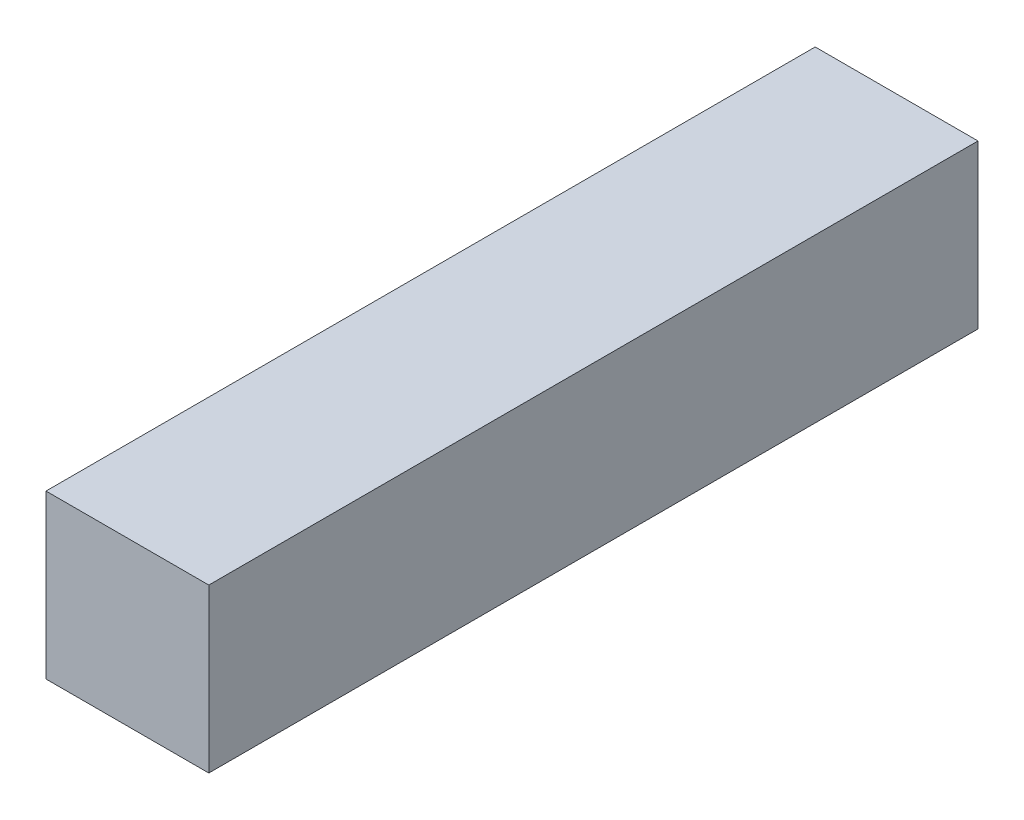
ISO-10303-21;
HEADER;
FILE_DESCRIPTION(('STEP AP214'),'2;1');
FILE_NAME('part.step','',(''),(''),'','','');
FILE_SCHEMA(('AUTOMOTIVE_DESIGN { 1 0 10303 214 1 1 1 1 }'));
ENDSEC;
DATA;
#1=APPLICATION_CONTEXT('core data for automotive mechanical design processes');
#2=APPLICATION_PROTOCOL_DEFINITION('international standard','automotive_design',2000,#1);
#3=PRODUCT_CONTEXT('',#1,'mechanical');
#4=PRODUCT('Part','Part','',(#3));
#5=PRODUCT_RELATED_PRODUCT_CATEGORY('part','',(#4));
#6=PRODUCT_DEFINITION_FORMATION('','',#4);
#7=PRODUCT_DEFINITION_CONTEXT('part definition',#1,'design');
#8=PRODUCT_DEFINITION('design','',#6,#7);
#9=PRODUCT_DEFINITION_SHAPE('','',#8);
#10=(LENGTH_UNIT() NAMED_UNIT(*) SI_UNIT(.MILLI.,.METRE.));
#11=(NAMED_UNIT(*) PLANE_ANGLE_UNIT() SI_UNIT($,.RADIAN.));
#12=(NAMED_UNIT(*) SI_UNIT($,.STERADIAN.) SOLID_ANGLE_UNIT());
#13=UNCERTAINTY_MEASURE_WITH_UNIT(LENGTH_MEASURE(1.E-05),#10,'distance_accuracy_value','');
#14=(GEOMETRIC_REPRESENTATION_CONTEXT(3) GLOBAL_UNCERTAINTY_ASSIGNED_CONTEXT((#13)) GLOBAL_UNIT_ASSIGNED_CONTEXT((#10,
#11,#12)) REPRESENTATION_CONTEXT('',''));
#15=CARTESIAN_POINT('',(0.,0.,0.));
#16=DIRECTION('',(0.,0.,1.));
#17=DIRECTION('',(1.,0.,0.));
#18=AXIS2_PLACEMENT_3D('',#15,#16,#17);
#19=CARTESIAN_POINT('',(3.175,-3.175,30.));
#20=DIRECTION('',(-1.,0.,0.));
#21=DIRECTION('',(0.,0.,1.));
#22=AXIS2_PLACEMENT_3D('',#19,#20,#21);
#23=PLANE('',#22);
#24=DIRECTION('',(0.,0.,1.));
#25=VECTOR('',#24,1.);
#26=CARTESIAN_POINT('',(3.175,3.175,30.));
#27=LINE('',#26,#25);
#28=CARTESIAN_POINT('',(3.175,3.175,0.));
#29=VERTEX_POINT('',#28);
#30=CARTESIAN_POINT('',(3.175,3.175,30.));
#31=VERTEX_POINT('',#30);
#32=EDGE_CURVE('E20',#29,#31,#27,.T.);
#33=ORIENTED_EDGE('',*,*,#32,.T.);
#34=DIRECTION('',(0.,1.,0.));
#35=VECTOR('',#34,1.);
#36=CARTESIAN_POINT('',(3.175,0.,30.));
#37=LINE('',#36,#35);
#38=CARTESIAN_POINT('',(3.175,-3.175,30.));
#39=VERTEX_POINT('',#38);
#40=EDGE_CURVE('E55',#39,#31,#37,.T.);
#41=ORIENTED_EDGE('',*,*,#40,.F.);
#42=DIRECTION('',(0.,0.,1.));
#43=VECTOR('',#42,1.);
#44=CARTESIAN_POINT('',(3.175,-3.175,30.));
#45=LINE('',#44,#43);
#46=CARTESIAN_POINT('',(3.175,-3.175,0.));
#47=VERTEX_POINT('',#46);
#48=EDGE_CURVE('E74',#39,#47,#45,.F.);
#49=ORIENTED_EDGE('',*,*,#48,.T.);
#50=DIRECTION('',(0.,1.,0.));
#51=VECTOR('',#50,1.);
#52=CARTESIAN_POINT('',(3.175,0.,0.));
#53=LINE('',#52,#51);
#54=EDGE_CURVE('E66',#47,#29,#53,.T.);
#55=ORIENTED_EDGE('',*,*,#54,.T.);
#56=EDGE_LOOP('',(#33,#41,#49,#55));
#57=FACE_BOUND('',#56,.T.);
#58=ADVANCED_FACE('F17',(#57),#23,.F.);
#59=CARTESIAN_POINT('',(3.175,3.175,30.));
#60=DIRECTION('',(0.,-1.,0.));
#61=DIRECTION('',(1.,0.,0.));
#62=AXIS2_PLACEMENT_3D('',#59,#60,#61);
#63=PLANE('',#62);
#64=DIRECTION('',(0.,0.,-1.));
#65=VECTOR('',#64,1.);
#66=CARTESIAN_POINT('',(-3.175,3.175,30.));
#67=LINE('',#66,#65);
#68=CARTESIAN_POINT('',(-3.175,3.175,0.));
#69=VERTEX_POINT('',#68);
#70=CARTESIAN_POINT('',(-3.175,3.175,30.));
#71=VERTEX_POINT('',#70);
#72=EDGE_CURVE('E72',#69,#71,#67,.F.);
#73=ORIENTED_EDGE('',*,*,#72,.T.);
#74=DIRECTION('',(1.,0.,0.));
#75=VECTOR('',#74,1.);
#76=CARTESIAN_POINT('',(0.,3.175,30.));
#77=LINE('',#76,#75);
#78=EDGE_CURVE('E62',#31,#71,#77,.F.);
#79=ORIENTED_EDGE('',*,*,#78,.F.);
#80=ORIENTED_EDGE('',*,*,#32,.F.);
#81=DIRECTION('',(1.,0.,0.));
#82=VECTOR('',#81,1.);
#83=CARTESIAN_POINT('',(0.,3.175,0.));
#84=LINE('',#83,#82);
#85=EDGE_CURVE('E80',#29,#69,#84,.F.);
#86=ORIENTED_EDGE('',*,*,#85,.T.);
#87=EDGE_LOOP('',(#73,#79,#80,#86));
#88=FACE_BOUND('',#87,.T.);
#89=ADVANCED_FACE('F71',(#88),#63,.F.);
#90=CARTESIAN_POINT('',(0.,0.,30.));
#91=DIRECTION('',(0.,0.,1.));
#92=DIRECTION('',(1.,0.,0.));
#93=AXIS2_PLACEMENT_3D('',#90,#91,#92);
#94=PLANE('',#93);
#95=ORIENTED_EDGE('',*,*,#40,.T.);
#96=ORIENTED_EDGE('',*,*,#78,.T.);
#97=DIRECTION('',(0.,1.,0.));
#98=VECTOR('',#97,1.);
#99=CARTESIAN_POINT('',(-3.175,-3.175,30.));
#100=LINE('',#99,#98);
#101=CARTESIAN_POINT('',(-3.175,-3.175,30.));
#102=VERTEX_POINT('',#101);
#103=EDGE_CURVE('E83',#71,#102,#100,.F.);
#104=ORIENTED_EDGE('',*,*,#103,.T.);
#105=DIRECTION('',(-1.,0.,0.));
#106=VECTOR('',#105,1.);
#107=CARTESIAN_POINT('',(3.175,-3.175,30.));
#108=LINE('',#107,#106);
#109=EDGE_CURVE('E64',#102,#39,#108,.F.);
#110=ORIENTED_EDGE('',*,*,#109,.T.);
#111=EDGE_LOOP('',(#95,#96,#104,#110));
#112=FACE_BOUND('',#111,.T.);
#113=ADVANCED_FACE('F59',(#112),#94,.T.);
#114=CARTESIAN_POINT('',(3.175,-3.175,30.));
#115=DIRECTION('',(0.,1.,0.));
#116=DIRECTION('',(-1.,0.,0.));
#117=AXIS2_PLACEMENT_3D('',#114,#115,#116);
#118=PLANE('',#117);
#119=ORIENTED_EDGE('',*,*,#48,.F.);
#120=ORIENTED_EDGE('',*,*,#109,.F.);
#121=DIRECTION('',(0.,0.,-1.));
#122=VECTOR('',#121,1.);
#123=CARTESIAN_POINT('',(-3.175,-3.175,30.));
#124=LINE('',#123,#122);
#125=CARTESIAN_POINT('',(-3.175,-3.175,0.));
#126=VERTEX_POINT('',#125);
#127=EDGE_CURVE('E26',#102,#126,#124,.T.);
#128=ORIENTED_EDGE('',*,*,#127,.T.);
#129=DIRECTION('',(1.,0.,0.));
#130=VECTOR('',#129,1.);
#131=CARTESIAN_POINT('',(0.,-3.175,0.));
#132=LINE('',#131,#130);
#133=EDGE_CURVE('E34',#126,#47,#132,.T.);
#134=ORIENTED_EDGE('',*,*,#133,.T.);
#135=EDGE_LOOP('',(#119,#120,#128,#134));
#136=FACE_BOUND('',#135,.T.);
#137=ADVANCED_FACE('F88',(#136),#118,.F.);
#138=CARTESIAN_POINT('',(0.,0.,0.));
#139=DIRECTION('',(0.,0.,1.));
#140=DIRECTION('',(1.,0.,0.));
#141=AXIS2_PLACEMENT_3D('',#138,#139,#140);
#142=PLANE('',#141);
#143=ORIENTED_EDGE('',*,*,#85,.F.);
#144=ORIENTED_EDGE('',*,*,#54,.F.);
#145=ORIENTED_EDGE('',*,*,#133,.F.);
#146=DIRECTION('',(0.,1.,0.));
#147=VECTOR('',#146,1.);
#148=CARTESIAN_POINT('',(-3.175,-3.175,0.));
#149=LINE('',#148,#147);
#150=EDGE_CURVE('E11',#126,#69,#149,.T.);
#151=ORIENTED_EDGE('',*,*,#150,.T.);
#152=EDGE_LOOP('',(#143,#144,#145,#151));
#153=FACE_BOUND('',#152,.T.);
#154=ADVANCED_FACE('F91',(#153),#142,.F.);
#155=CARTESIAN_POINT('',(-3.175,-3.175,30.));
#156=DIRECTION('',(1.,0.,0.));
#157=DIRECTION('',(0.,0.,-1.));
#158=AXIS2_PLACEMENT_3D('',#155,#156,#157);
#159=PLANE('',#158);
#160=ORIENTED_EDGE('',*,*,#127,.F.);
#161=ORIENTED_EDGE('',*,*,#103,.F.);
#162=ORIENTED_EDGE('',*,*,#72,.F.);
#163=ORIENTED_EDGE('',*,*,#150,.F.);
#164=EDGE_LOOP('',(#160,#161,#162,#163));
#165=FACE_BOUND('',#164,.T.);
#166=ADVANCED_FACE('F90',(#165),#159,.F.);
#167=CLOSED_SHELL('',(#58,#89,#113,#137,#154,#166));
#168=MANIFOLD_SOLID_BREP('B1',#167);
#169=ADVANCED_BREP_SHAPE_REPRESENTATION('',(#18,#168),#14);
#170=SHAPE_DEFINITION_REPRESENTATION(#9,#169);
ENDSEC;
END-ISO-10303-21;
